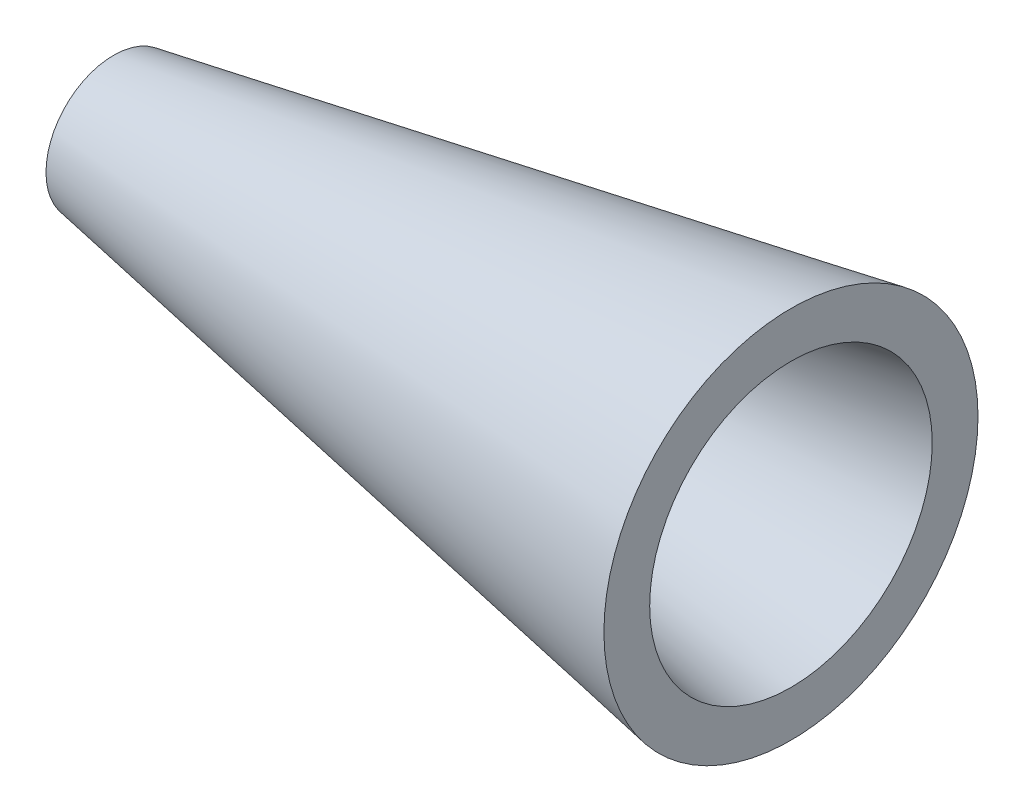
ISO-10303-21;
HEADER;
FILE_DESCRIPTION(('STEP AP214'),'2;1');
FILE_NAME('part.step','',(''),(''),'','','');
FILE_SCHEMA(('AUTOMOTIVE_DESIGN { 1 0 10303 214 1 1 1 1 }'));
ENDSEC;
DATA;
#1=APPLICATION_CONTEXT('core data for automotive mechanical design processes');
#2=APPLICATION_PROTOCOL_DEFINITION('international standard','automotive_design',2000,#1);
#3=PRODUCT_CONTEXT('',#1,'mechanical');
#4=PRODUCT('Part','Part','',(#3));
#5=PRODUCT_RELATED_PRODUCT_CATEGORY('part','',(#4));
#6=PRODUCT_DEFINITION_FORMATION('','',#4);
#7=PRODUCT_DEFINITION_CONTEXT('part definition',#1,'design');
#8=PRODUCT_DEFINITION('design','',#6,#7);
#9=PRODUCT_DEFINITION_SHAPE('','',#8);
#10=(LENGTH_UNIT() NAMED_UNIT(*) SI_UNIT(.MILLI.,.METRE.));
#11=(NAMED_UNIT(*) PLANE_ANGLE_UNIT() SI_UNIT($,.RADIAN.));
#12=(NAMED_UNIT(*) SI_UNIT($,.STERADIAN.) SOLID_ANGLE_UNIT());
#13=UNCERTAINTY_MEASURE_WITH_UNIT(LENGTH_MEASURE(1.E-05),#10,'distance_accuracy_value','');
#14=(GEOMETRIC_REPRESENTATION_CONTEXT(3) GLOBAL_UNCERTAINTY_ASSIGNED_CONTEXT((#13)) GLOBAL_UNIT_ASSIGNED_CONTEXT((#10,
#11,#12)) REPRESENTATION_CONTEXT('',''));
#15=CARTESIAN_POINT('',(0.,0.,0.));
#16=DIRECTION('',(0.,0.,1.));
#17=DIRECTION('',(1.,0.,0.));
#18=AXIS2_PLACEMENT_3D('',#15,#16,#17);
#19=CARTESIAN_POINT('',(-19.9996693421905,0.,0.));
#20=DIRECTION('',(1.,0.,0.));
#21=DIRECTION('',(0.,0.,-1.));
#22=AXIS2_PLACEMENT_3D('',#19,#20,#21);
#23=PLANE('',#22);
#24=CARTESIAN_POINT('',(-19.9996693421905,0.,0.));
#25=DIRECTION('',(-1.,0.,0.));
#26=DIRECTION('',(0.,0.,1.));
#27=AXIS2_PLACEMENT_3D('',#24,#25,#26);
#28=CIRCLE('',#27,3.);
#29=CARTESIAN_POINT('',(-19.9996693421905,0.,3.));
#30=VERTEX_POINT('',#29);
#31=EDGE_CURVE('E10',#30,#30,#28,.T.);
#32=ORIENTED_EDGE('',*,*,#31,.T.);
#33=EDGE_LOOP('',(#32));
#34=FACE_BOUND('',#33,.T.);
#35=ADVANCED_FACE('F37',(#34),#23,.F.);
#36=CARTESIAN_POINT('',(10.0581243017832,0.,0.));
#37=DIRECTION('',(1.,0.,0.));
#38=DIRECTION('',(0.,0.,-1.));
#39=AXIS2_PLACEMENT_3D('',#36,#37,#38);
#40=CONICAL_SURFACE('',#39,8.3,0.174532925199434);
#41=ORIENTED_EDGE('',*,*,#31,.F.);
#42=EDGE_LOOP('',(#41));
#43=FACE_BOUND('',#42,.T.);
#44=CARTESIAN_POINT('',(10.0581243017832,0.,0.));
#45=DIRECTION('',(-1.,0.,0.));
#46=DIRECTION('',(0.,0.,1.));
#47=AXIS2_PLACEMENT_3D('',#44,#45,#46);
#48=CIRCLE('',#47,8.3);
#49=CARTESIAN_POINT('',(10.0581243017832,0.,8.3));
#50=VERTEX_POINT('',#49);
#51=EDGE_CURVE('E44',#50,#50,#48,.T.);
#52=ORIENTED_EDGE('',*,*,#51,.T.);
#53=EDGE_LOOP('',(#52));
#54=FACE_BOUND('',#53,.T.);
#55=ADVANCED_FACE('F76',(#43,#54),#40,.T.);
#56=CARTESIAN_POINT('',(10.0581243017832,8.3,0.));
#57=DIRECTION('',(-1.,0.,0.));
#58=DIRECTION('',(0.,0.,1.));
#59=AXIS2_PLACEMENT_3D('',#56,#57,#58);
#60=PLANE('',#59);
#61=CARTESIAN_POINT('',(10.0581243017832,0.,0.));
#62=DIRECTION('',(-1.,0.,0.));
#63=DIRECTION('',(0.,0.,1.));
#64=AXIS2_PLACEMENT_3D('',#61,#62,#63);
#65=CIRCLE('',#64,6.26914677622851);
#66=CARTESIAN_POINT('',(10.0581243017832,0.,-6.26914677622851));
#67=VERTEX_POINT('',#66);
#68=EDGE_CURVE('E54',#67,#67,#65,.T.);
#69=ORIENTED_EDGE('',*,*,#68,.T.);
#70=EDGE_LOOP('',(#69));
#71=FACE_BOUND('',#70,.T.);
#72=ORIENTED_EDGE('',*,*,#51,.F.);
#73=EDGE_LOOP('',(#72));
#74=FACE_BOUND('',#73,.T.);
#75=ADVANCED_FACE('F61',(#71,#74),#60,.F.);
#76=CARTESIAN_POINT('',(-17.9996693421905,0.,0.));
#77=DIRECTION('',(1.,0.,0.));
#78=DIRECTION('',(0.,0.,-1.));
#79=AXIS2_PLACEMENT_3D('',#76,#77,#78);
#80=PLANE('',#79);
#81=CARTESIAN_POINT('',(-17.9996693421905,0.,0.));
#82=DIRECTION('',(1.,0.,0.));
#83=DIRECTION('',(0.,0.,-1.));
#84=AXIS2_PLACEMENT_3D('',#81,#82,#83);
#85=CIRCLE('',#84,1.32180073764544);
#86=CARTESIAN_POINT('',(-17.9996693421905,0.,-1.32180073764544));
#87=VERTEX_POINT('',#86);
#88=EDGE_CURVE('E49',#87,#87,#85,.F.);
#89=ORIENTED_EDGE('',*,*,#88,.F.);
#90=EDGE_LOOP('',(#89));
#91=FACE_BOUND('',#90,.T.);
#92=ADVANCED_FACE('F66',(#91),#80,.T.);
#93=CARTESIAN_POINT('',(10.4054206571171,0.,0.));
#94=DIRECTION('',(1.,0.,0.));
#95=DIRECTION('',(0.,0.,-1.));
#96=AXIS2_PLACEMENT_3D('',#93,#94,#95);
#97=CONICAL_SURFACE('',#96,6.33038449397558,0.174532925199434);
#98=CARTESIAN_POINT('',(-17.9996693421905,0.,-1.32180073764544));
#99=CARTESIAN_POINT('',(-17.7074006583991,0.,-1.37333559221401));
#100=CARTESIAN_POINT('',(-17.4151319746077,0.,-1.42487044678259));
#101=CARTESIAN_POINT('',(-16.8305946070249,0.,-1.52794015591973));
#102=CARTESIAN_POINT('',(-16.5383259232335,0.,-1.57947501048831));
#103=CARTESIAN_POINT('',(-15.9537885556508,0.,-1.68254471962545));
#104=CARTESIAN_POINT('',(-15.6615198718594,0.,-1.73407957419403));
#105=CARTESIAN_POINT('',(-15.0769825042766,0.,-1.83714928333118));
#106=CARTESIAN_POINT('',(-14.7847138204852,0.,-1.88868413789975));
#107=CARTESIAN_POINT('',(-14.2001764529024,0.,-1.9917538470369));
#108=CARTESIAN_POINT('',(-13.907907769111,0.,-2.04328870160547));
#109=CARTESIAN_POINT('',(-13.3233704015282,0.,-2.14635841074262));
#110=CARTESIAN_POINT('',(-13.0311017177368,0.,-2.19789326531119));
#111=CARTESIAN_POINT('',(-12.446564350154,0.,-2.30096297444834));
#112=CARTESIAN_POINT('',(-12.1542956663627,0.,-2.35249782901691));
#113=CARTESIAN_POINT('',(-11.5697582987799,0.,-2.45556753815406));
#114=CARTESIAN_POINT('',(-11.2774896149885,0.,-2.50710239272263));
#115=CARTESIAN_POINT('',(-10.6929522474057,0.,-2.61017210185978));
#116=CARTESIAN_POINT('',(-10.4006835636143,0.,-2.66170695642835));
#117=CARTESIAN_POINT('',(-9.81614619603151,0.,-2.7647766655655));
#118=CARTESIAN_POINT('',(-9.52387751224012,0.,-2.81631152013407));
#119=CARTESIAN_POINT('',(-8.93934014465733,0.,-2.91938122927122));
#120=CARTESIAN_POINT('',(-8.64707146086594,0.,-2.9709160838398));
#121=CARTESIAN_POINT('',(-8.06253409328316,0.,-3.07398579297694));
#122=CARTESIAN_POINT('',(-7.77026540949176,0.,-3.12552064754552));
#123=CARTESIAN_POINT('',(-7.18572804190898,0.,-3.22859035668266));
#124=CARTESIAN_POINT('',(-6.89345935811759,0.,-3.28012521125124));
#125=CARTESIAN_POINT('',(-6.3089219905348,0.,-3.38319492038838));
#126=CARTESIAN_POINT('',(-6.01665330674341,0.,-3.43472977495696));
#127=CARTESIAN_POINT('',(-5.43211593916062,0.,-3.53779948409411));
#128=CARTESIAN_POINT('',(-5.13984725536923,0.,-3.58933433866268));
#129=CARTESIAN_POINT('',(-4.55530988778644,0.,-3.69240404779983));
#130=CARTESIAN_POINT('',(-4.26304120399505,0.,-3.7439389023684));
#131=CARTESIAN_POINT('',(-3.67850383641227,0.,-3.84700861150555));
#132=CARTESIAN_POINT('',(-3.38623515262087,0.,-3.89854346607412));
#133=CARTESIAN_POINT('',(-2.80169778503809,0.,-4.00161317521127));
#134=CARTESIAN_POINT('',(-2.50942910124669,0.,-4.05314802977984));
#135=CARTESIAN_POINT('',(-1.92489173366391,0.,-4.15621773891699));
#136=CARTESIAN_POINT('',(-1.63262304987252,0.,-4.20775259348556));
#137=CARTESIAN_POINT('',(-1.04808568228973,0.,-4.31082230262271));
#138=CARTESIAN_POINT('',(-0.755816998498338,0.,-4.36235715719128));
#139=CARTESIAN_POINT('',(-0.171279630915553,0.,-4.46542686632843));
#140=CARTESIAN_POINT('',(0.120989052875839,0.,-4.516961720897));
#141=CARTESIAN_POINT('',(0.705526420458624,0.,-4.62003143003415));
#142=CARTESIAN_POINT('',(0.997795104250018,0.,-4.67156628460273));
#143=CARTESIAN_POINT('',(1.5823324718328,0.,-4.77463599373987));
#144=CARTESIAN_POINT('',(1.8746011556242,0.,-4.82617084830845));
#145=CARTESIAN_POINT('',(2.45913852320698,0.,-4.92924055744559));
#146=CARTESIAN_POINT('',(2.75140720699838,0.,-4.98077541201417));
#147=CARTESIAN_POINT('',(3.33594457458116,0.,-5.08384512115132));
#148=CARTESIAN_POINT('',(3.62821325837255,0.,-5.13537997571989));
#149=CARTESIAN_POINT('',(4.21275062595534,0.,-5.23844968485704));
#150=CARTESIAN_POINT('',(4.50501930974673,0.,-5.28998453942561));
#151=CARTESIAN_POINT('',(5.08955667732952,0.,-5.39305424856276));
#152=CARTESIAN_POINT('',(5.38182536112091,0.,-5.44458910313133));
#153=CARTESIAN_POINT('',(5.9663627287037,0.,-5.54765881226848));
#154=CARTESIAN_POINT('',(6.25863141249509,0.,-5.59919366683705));
#155=CARTESIAN_POINT('',(6.84316878007787,0.,-5.7022633759742));
#156=CARTESIAN_POINT('',(7.13543746386926,0.,-5.75379823054277));
#157=CARTESIAN_POINT('',(7.71997483145205,0.,-5.85686793967992));
#158=CARTESIAN_POINT('',(8.01224351524344,0.,-5.90840279424849));
#159=CARTESIAN_POINT('',(8.59678088282623,0.,-6.01147250338564));
#160=CARTESIAN_POINT('',(8.88904956661762,0.,-6.06300735795422));
#161=CARTESIAN_POINT('',(9.47358693420041,0.,-6.16607706709136));
#162=CARTESIAN_POINT('',(9.7658556179918,0.,-6.21761192165994));
#163=CARTESIAN_POINT('',(10.0581243017832,0.,-6.26914677622851));
#164=B_SPLINE_CURVE_WITH_KNOTS('',3,(#98,#99,#100,#101,#102,#103,#104,#105,#106,#107,#108,#109,
#110,#111,#112,#113,#114,#115,#116,#117,#118,#119,#120,#121,#122,#123,#124,#125,#126,#127,#128,
#129,#130,#131,#132,#133,#134,#135,#136,#137,#138,#139,#140,#141,#142,#143,#144,#145,#146,#147,
#148,#149,#150,#151,#152,#153,#154,#155,#156,#157,#158,#159,#160,#161,#162,#163),.UNSPECIFIED.,
.F.,.F.,(4,2,2,2,2,2,2,2,2,2,2,2,2,2,2,2,2,2,2,2,2,2,2,2,2,2,2,2,2,2,2,2,4),(0.,
0.890332198027799,1.7806643960556,2.6709965940834,3.5613287921112,4.451660990139,
5.3419931881668,6.23232538619461,7.1226575842224,8.0129897822502,8.903321980278,
9.79365417830581,10.6839863763336,11.5743185743614,12.4646507723892,13.354982970417,
14.2453151684448,15.1356473664726,16.0259795645004,16.9163117625282,17.806643960556,
18.6969761585838,19.5873083566116,20.4776405546394,21.3679727526672,22.258304950695,
23.1486371487228,24.0389693467506,24.9293015447784,25.8196337428062,26.709965940834,
27.6002981388618,28.4906303368896),.UNSPECIFIED.);
#165=EDGE_CURVE('BSEAM64',#87,#67,#164,.T.);
#166=ORIENTED_EDGE('',*,*,#88,.T.);
#167=ORIENTED_EDGE('',*,*,#68,.F.);
#168=ORIENTED_EDGE('',*,*,#165,.T.);
#169=ORIENTED_EDGE('',*,*,#165,.F.);
#170=EDGE_LOOP('',(#166,#168,#167,#169));
#171=FACE_BOUND('',#170,.T.);
#172=ADVANCED_FACE('F64',(#171),#97,.F.);
#173=CLOSED_SHELL('',(#35,#55,#75,#92,#172));
#174=MANIFOLD_SOLID_BREP('B2',#173);
#175=ADVANCED_BREP_SHAPE_REPRESENTATION('',(#18,#174),#14);
#176=SHAPE_DEFINITION_REPRESENTATION(#9,#175);
ENDSEC;
END-ISO-10303-21;
